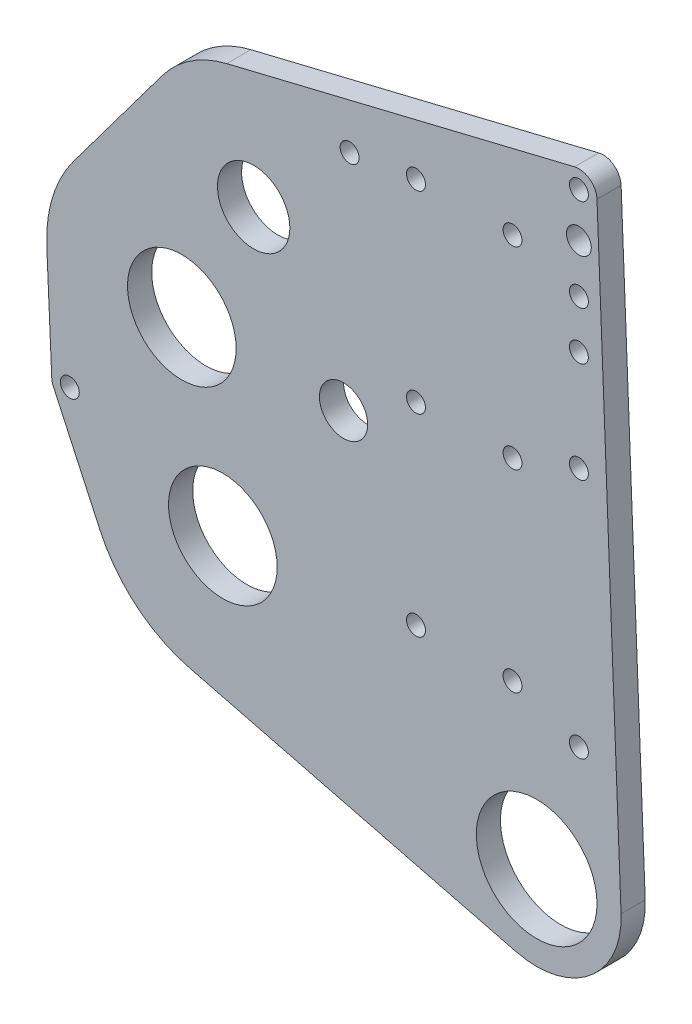
ISO-10303-21;
HEADER;
FILE_DESCRIPTION(('STEP AP214'),'2;1');
FILE_NAME('part.step','',(''),(''),'','','');
FILE_SCHEMA(('AUTOMOTIVE_DESIGN { 1 0 10303 214 1 1 1 1 }'));
ENDSEC;
DATA;
#1=APPLICATION_CONTEXT('core data for automotive mechanical design processes');
#2=APPLICATION_PROTOCOL_DEFINITION('international standard','automotive_design',2000,#1);
#3=PRODUCT_CONTEXT('',#1,'mechanical');
#4=PRODUCT('Part','Part','',(#3));
#5=PRODUCT_RELATED_PRODUCT_CATEGORY('part','',(#4));
#6=PRODUCT_DEFINITION_FORMATION('','',#4);
#7=PRODUCT_DEFINITION_CONTEXT('part definition',#1,'design');
#8=PRODUCT_DEFINITION('design','',#6,#7);
#9=PRODUCT_DEFINITION_SHAPE('','',#8);
#10=(LENGTH_UNIT() NAMED_UNIT(*) SI_UNIT(.MILLI.,.METRE.));
#11=(NAMED_UNIT(*) PLANE_ANGLE_UNIT() SI_UNIT($,.RADIAN.));
#12=(NAMED_UNIT(*) SI_UNIT($,.STERADIAN.) SOLID_ANGLE_UNIT());
#13=UNCERTAINTY_MEASURE_WITH_UNIT(LENGTH_MEASURE(1.E-05),#10,'distance_accuracy_value','');
#14=(GEOMETRIC_REPRESENTATION_CONTEXT(3) GLOBAL_UNCERTAINTY_ASSIGNED_CONTEXT((#13)) GLOBAL_UNIT_ASSIGNED_CONTEXT((#10,
#11,#12)) REPRESENTATION_CONTEXT('',''));
#15=CARTESIAN_POINT('',(0.,0.,0.));
#16=DIRECTION('',(0.,0.,1.));
#17=DIRECTION('',(1.,0.,0.));
#18=AXIS2_PLACEMENT_3D('',#15,#16,#17);
#19=CARTESIAN_POINT('',(-81.4649837073853,-3.60509332241219,6.35));
#20=DIRECTION('',(0.999022259122611,0.0442100189725756,0.));
#21=DIRECTION('',(-0.0442100189725756,0.999022259122611,0.));
#22=AXIS2_PLACEMENT_3D('',#19,#20,#21);
#23=PLANE('',#22);
#24=DIRECTION('',(0.0442100189725756,-0.999022259122611,0.));
#25=VECTOR('',#24,1.);
#26=CARTESIAN_POINT('',(-81.4649837073853,-3.60509332241219,0.));
#27=LINE('',#26,#25);
#28=CARTESIAN_POINT('',(-84.4202315344,63.1752073656032,0.));
#29=VERTEX_POINT('',#28);
#30=CARTESIAN_POINT('',(-83.1225405635379,33.8510361600236,0.));
#31=VERTEX_POINT('',#30);
#32=EDGE_CURVE('E248',#29,#31,#27,.T.);
#33=ORIENTED_EDGE('',*,*,#32,.T.);
#34=DIRECTION('',(0.,0.,-1.));
#35=VECTOR('',#34,1.);
#36=CARTESIAN_POINT('',(-83.1225405635379,33.8510361600236,6.35));
#37=LINE('',#36,#35);
#38=CARTESIAN_POINT('',(-83.1225405635379,33.8510361600236,6.35));
#39=VERTEX_POINT('',#38);
#40=EDGE_CURVE('E11',#39,#31,#37,.T.);
#41=ORIENTED_EDGE('',*,*,#40,.F.);
#42=DIRECTION('',(0.0442100189725756,-0.999022259122611,0.));
#43=VECTOR('',#42,1.);
#44=CARTESIAN_POINT('',(-81.4649837073853,-3.60509332241219,6.35));
#45=LINE('',#44,#43);
#46=CARTESIAN_POINT('',(-84.4202315344,63.1752073656032,6.35));
#47=VERTEX_POINT('',#46);
#48=EDGE_CURVE('E362',#47,#39,#45,.T.);
#49=ORIENTED_EDGE('',*,*,#48,.F.);
#50=DIRECTION('',(0.,0.,-1.));
#51=VECTOR('',#50,1.);
#52=CARTESIAN_POINT('',(-84.4202315344,63.1752073656032,6.35));
#53=LINE('',#52,#51);
#54=EDGE_CURVE('E168',#47,#29,#53,.T.);
#55=ORIENTED_EDGE('',*,*,#54,.T.);
#56=EDGE_LOOP('',(#33,#41,#49,#55));
#57=FACE_BOUND('',#56,.T.);
#58=ADVANCED_FACE('F47',(#57),#23,.F.);
#59=CARTESIAN_POINT('',(-78.3646970544664,34.0615863753805,6.35));
#60=DIRECTION('',(0.,0.,-1.));
#61=DIRECTION('',(-1.,0.,0.));
#62=AXIS2_PLACEMENT_3D('',#59,#60,#61);
#63=CYLINDRICAL_SURFACE('',#62,4.76250000000001);
#64=CARTESIAN_POINT('',(-78.3646970544664,34.0615863753805,0.));
#65=DIRECTION('',(0.,0.,1.));
#66=DIRECTION('',(1.,0.,0.));
#67=AXIS2_PLACEMENT_3D('',#64,#65,#66);
#68=CIRCLE('',#67,4.76250000000001);
#69=CARTESIAN_POINT('',(-82.6886710093196,32.0654261894858,0.));
#70=VERTEX_POINT('',#69);
#71=EDGE_CURVE('E252',#31,#70,#68,.T.);
#72=ORIENTED_EDGE('',*,*,#71,.T.);
#73=DIRECTION('',(0.,0.,-1.));
#74=VECTOR('',#73,1.);
#75=CARTESIAN_POINT('',(-82.6886710093196,32.0654261894858,6.35));
#76=LINE('',#75,#74);
#77=CARTESIAN_POINT('',(-82.6886710093196,32.0654261894858,6.35));
#78=VERTEX_POINT('',#77);
#79=EDGE_CURVE('E57',#78,#70,#76,.T.);
#80=ORIENTED_EDGE('',*,*,#79,.F.);
#81=CARTESIAN_POINT('',(-78.3646970544664,34.0615863753805,6.35));
#82=DIRECTION('',(0.,0.,1.));
#83=DIRECTION('',(1.,0.,0.));
#84=AXIS2_PLACEMENT_3D('',#81,#82,#83);
#85=CIRCLE('',#84,4.76250000000001);
#86=EDGE_CURVE('E120',#39,#78,#85,.T.);
#87=ORIENTED_EDGE('',*,*,#86,.F.);
#88=ORIENTED_EDGE('',*,*,#40,.T.);
#89=EDGE_LOOP('',(#72,#80,#87,#88));
#90=FACE_BOUND('',#89,.T.);
#91=ADVANCED_FACE('F377',(#90),#63,.T.);
#92=CARTESIAN_POINT('',(-55.9595694301041,-25.8337042920453,6.35));
#93=DIRECTION('',(0.907921040389125,0.419141246382087,0.));
#94=DIRECTION('',(-0.419141246382087,0.907921040389125,0.));
#95=AXIS2_PLACEMENT_3D('',#92,#93,#94);
#96=PLANE('',#95);
#97=DIRECTION('',(0.419141246382087,-0.907921040389125,0.));
#98=VECTOR('',#97,1.);
#99=CARTESIAN_POINT('',(-55.9595694301041,-25.8337042920453,0.));
#100=LINE('',#99,#98);
#101=CARTESIAN_POINT('',(-70.3856721962373,5.41533727865297,0.));
#102=VERTEX_POINT('',#101);
#103=EDGE_CURVE('E255',#70,#102,#100,.T.);
#104=ORIENTED_EDGE('',*,*,#103,.T.);
#105=DIRECTION('',(0.,0.,-1.));
#106=VECTOR('',#105,1.);
#107=CARTESIAN_POINT('',(-70.3856721962373,5.41533727865297,6.35));
#108=LINE('',#107,#106);
#109=CARTESIAN_POINT('',(-70.3856721962373,5.41533727865297,6.35));
#110=VERTEX_POINT('',#109);
#111=EDGE_CURVE('E310',#110,#102,#108,.T.);
#112=ORIENTED_EDGE('',*,*,#111,.F.);
#113=DIRECTION('',(0.419141246382087,-0.907921040389125,0.));
#114=VECTOR('',#113,1.);
#115=CARTESIAN_POINT('',(-55.9595694301041,-25.8337042920453,6.35));
#116=LINE('',#115,#114);
#117=EDGE_CURVE('E320',#78,#110,#116,.T.);
#118=ORIENTED_EDGE('',*,*,#117,.F.);
#119=ORIENTED_EDGE('',*,*,#79,.T.);
#120=EDGE_LOOP('',(#104,#112,#118,#119));
#121=FACE_BOUND('',#120,.T.);
#122=ADVANCED_FACE('F318',(#121),#96,.F.);
#123=CARTESIAN_POINT('',(-38.1,20.32,6.35));
#124=DIRECTION('',(0.,0.,-1.));
#125=DIRECTION('',(-1.,0.,0.));
#126=AXIS2_PLACEMENT_3D('',#123,#124,#125);
#127=CYLINDRICAL_SURFACE('',#126,35.56);
#128=CARTESIAN_POINT('',(-38.1,20.32,0.));
#129=DIRECTION('',(0.,0.,1.));
#130=DIRECTION('',(1.,0.,0.));
#131=AXIS2_PLACEMENT_3D('',#128,#129,#130);
#132=CIRCLE('',#131,35.56);
#133=CARTESIAN_POINT('',(-46.8094811901803,-14.1569276096043,0.));
#134=VERTEX_POINT('',#133);
#135=EDGE_CURVE('E258',#102,#134,#132,.T.);
#136=ORIENTED_EDGE('',*,*,#135,.T.);
#137=DIRECTION('',(0.,0.,-1.));
#138=VECTOR('',#137,1.);
#139=CARTESIAN_POINT('',(-46.8094811901803,-14.1569276096043,6.35));
#140=LINE('',#139,#138);
#141=CARTESIAN_POINT('',(-46.8094811901803,-14.1569276096043,6.35));
#142=VERTEX_POINT('',#141);
#143=EDGE_CURVE('E306',#142,#134,#140,.T.);
#144=ORIENTED_EDGE('',*,*,#143,.F.);
#145=CARTESIAN_POINT('',(-38.1,20.32,6.35));
#146=DIRECTION('',(0.,0.,1.));
#147=DIRECTION('',(1.,0.,0.));
#148=AXIS2_PLACEMENT_3D('',#145,#146,#147);
#149=CIRCLE('',#148,35.56);
#150=EDGE_CURVE('E339',#110,#142,#149,.T.);
#151=ORIENTED_EDGE('',*,*,#150,.F.);
#152=ORIENTED_EDGE('',*,*,#111,.T.);
#153=EDGE_LOOP('',(#136,#144,#151,#152));
#154=FACE_BOUND('',#153,.T.);
#155=ADVANCED_FACE('F329',(#154),#127,.T.);
#156=CARTESIAN_POINT('',(-6.1697429589074,-24.423243671959,6.35));
#157=DIRECTION('',(0.244923543030941,0.969542396220594,0.));
#158=DIRECTION('',(-0.969542396220594,0.244923543030941,0.));
#159=AXIS2_PLACEMENT_3D('',#156,#157,#158);
#160=PLANE('',#159);
#161=DIRECTION('',(0.969542396220594,-0.244923543030941,0.));
#162=VECTOR('',#161,1.);
#163=CARTESIAN_POINT('',(-6.1697429589074,-24.423243671959,0.));
#164=LINE('',#163,#162);
#165=CARTESIAN_POINT('',(39.0065742561373,-35.8355797560027,0.));
#166=VERTEX_POINT('',#165);
#167=EDGE_CURVE('E261',#134,#166,#164,.T.);
#168=ORIENTED_EDGE('',*,*,#167,.T.);
#169=DIRECTION('',(0.,0.,-1.));
#170=VECTOR('',#169,1.);
#171=CARTESIAN_POINT('',(39.0065742561373,-35.8355797560027,6.35));
#172=LINE('',#171,#170);
#173=CARTESIAN_POINT('',(39.0065742561373,-35.8355797560027,6.35));
#174=VERTEX_POINT('',#173);
#175=EDGE_CURVE('E302',#174,#166,#172,.T.);
#176=ORIENTED_EDGE('',*,*,#175,.F.);
#177=DIRECTION('',(0.969542396220594,-0.244923543030941,0.));
#178=VECTOR('',#177,1.);
#179=CARTESIAN_POINT('',(-6.1697429589074,-24.423243671959,6.35));
#180=LINE('',#179,#178);
#181=EDGE_CURVE('E335',#142,#174,#180,.T.);
#182=ORIENTED_EDGE('',*,*,#181,.F.);
#183=ORIENTED_EDGE('',*,*,#143,.T.);
#184=EDGE_LOOP('',(#168,#176,#182,#183));
#185=FACE_BOUND('',#184,.T.);
#186=ADVANCED_FACE('F333',(#185),#160,.F.);
#187=CARTESIAN_POINT('',(44.45,-14.2875,6.35));
#188=DIRECTION('',(0.,0.,-1.));
#189=DIRECTION('',(-1.,0.,0.));
#190=AXIS2_PLACEMENT_3D('',#187,#188,#189);
#191=CYLINDRICAL_SURFACE('',#190,22.225);
#192=CARTESIAN_POINT('',(44.45,-14.2875,0.));
#193=DIRECTION('',(0.,0.,1.));
#194=DIRECTION('',(1.,0.,0.));
#195=AXIS2_PLACEMENT_3D('',#192,#193,#194);
#196=CIRCLE('',#195,22.225);
#197=CARTESIAN_POINT('',(66.6575154334442,-13.4060901785567,0.));
#198=VERTEX_POINT('',#197);
#199=EDGE_CURVE('E264',#166,#198,#196,.T.);
#200=ORIENTED_EDGE('',*,*,#199,.T.);
#201=DIRECTION('',(0.,0.,-1.));
#202=VECTOR('',#201,1.);
#203=CARTESIAN_POINT('',(66.6575154334442,-13.4060901785567,6.35));
#204=LINE('',#203,#202);
#205=CARTESIAN_POINT('',(66.6575154334442,-13.4060901785567,6.35));
#206=VERTEX_POINT('',#205);
#207=EDGE_CURVE('E299',#206,#198,#204,.T.);
#208=ORIENTED_EDGE('',*,*,#207,.F.);
#209=CARTESIAN_POINT('',(44.45,-14.2875,6.35));
#210=DIRECTION('',(0.,0.,1.));
#211=DIRECTION('',(1.,0.,0.));
#212=AXIS2_PLACEMENT_3D('',#209,#210,#211);
#213=CIRCLE('',#212,22.225);
#214=EDGE_CURVE('E338',#174,#206,#213,.T.);
#215=ORIENTED_EDGE('',*,*,#214,.F.);
#216=ORIENTED_EDGE('',*,*,#175,.T.);
#217=EDGE_LOOP('',(#200,#208,#215,#216));
#218=FACE_BOUND('',#217,.T.);
#219=ADVANCED_FACE('F684',(#218),#191,.T.);
#220=CARTESIAN_POINT('',(66.0214298426699,2.62037132715079,6.35));
#221=DIRECTION('',(0.999213292843385,0.0396584846543646,0.));
#222=DIRECTION('',(-0.0396584846543647,0.999213292843385,0.));
#223=AXIS2_PLACEMENT_3D('',#220,#221,#222);
#224=PLANE('',#223);
#225=DIRECTION('',(0.0396584846543647,-0.999213292843385,0.));
#226=VECTOR('',#225,1.);
#227=CARTESIAN_POINT('',(66.0214298426699,2.62037132715079,0.));
#228=LINE('',#227,#226);
#229=CARTESIAN_POINT('',(60.3212533071744,146.238873533191,0.));
#230=VERTEX_POINT('',#229);
#231=EDGE_CURVE('E268',#230,#198,#228,.T.);
#232=ORIENTED_EDGE('',*,*,#231,.F.);
#233=DIRECTION('',(0.,0.,-1.));
#234=VECTOR('',#233,1.);
#235=CARTESIAN_POINT('',(60.3212533071744,146.238873533191,6.35));
#236=LINE('',#235,#234);
#237=CARTESIAN_POINT('',(60.3212533071744,146.238873533191,6.35));
#238=VERTEX_POINT('',#237);
#239=EDGE_CURVE('E296',#238,#230,#236,.T.);
#240=ORIENTED_EDGE('',*,*,#239,.F.);
#241=DIRECTION('',(0.0396584846543647,-0.999213292843385,0.));
#242=VECTOR('',#241,1.);
#243=CARTESIAN_POINT('',(66.0214298426699,2.62037132715079,6.35));
#244=LINE('',#243,#242);
#245=EDGE_CURVE('E343',#238,#206,#244,.T.);
#246=ORIENTED_EDGE('',*,*,#245,.T.);
#247=ORIENTED_EDGE('',*,*,#207,.T.);
#248=EDGE_LOOP('',(#232,#240,#246,#247));
#249=FACE_BOUND('',#248,.T.);
#250=ADVANCED_FACE('F674',(#249),#224,.T.);
#251=CARTESIAN_POINT('',(55.5625000000077,146.050000000024,6.35));
#252=DIRECTION('',(0.,0.,-1.));
#253=DIRECTION('',(-1.,0.,0.));
#254=AXIS2_PLACEMENT_3D('',#251,#252,#253);
#255=CYLINDRICAL_SURFACE('',#254,4.76250000000002);
#256=CARTESIAN_POINT('',(55.5625000000077,146.050000000024,0.));
#257=DIRECTION('',(0.,0.,1.));
#258=DIRECTION('',(1.,0.,0.));
#259=AXIS2_PLACEMENT_3D('',#256,#257,#258);
#260=CIRCLE('',#259,4.76250000000002);
#261=CARTESIAN_POINT('',(54.4379586815956,150.677830277075,0.));
#262=VERTEX_POINT('',#261);
#263=EDGE_CURVE('E272',#230,#262,#260,.T.);
#264=ORIENTED_EDGE('',*,*,#263,.T.);
#265=DIRECTION('',(0.,0.,-1.));
#266=VECTOR('',#265,1.);
#267=CARTESIAN_POINT('',(54.4379586815956,150.677830277075,6.35));
#268=LINE('',#267,#266);
#269=CARTESIAN_POINT('',(54.4379586815956,150.677830277075,6.35));
#270=VERTEX_POINT('',#269);
#271=EDGE_CURVE('E293',#270,#262,#268,.T.);
#272=ORIENTED_EDGE('',*,*,#271,.F.);
#273=CARTESIAN_POINT('',(55.5625000000077,146.050000000024,6.35));
#274=DIRECTION('',(0.,0.,1.));
#275=DIRECTION('',(1.,0.,0.));
#276=AXIS2_PLACEMENT_3D('',#273,#274,#275);
#277=CIRCLE('',#276,4.76250000000002);
#278=EDGE_CURVE('E351',#238,#270,#277,.T.);
#279=ORIENTED_EDGE('',*,*,#278,.F.);
#280=ORIENTED_EDGE('',*,*,#239,.T.);
#281=EDGE_LOOP('',(#264,#272,#279,#280));
#282=FACE_BOUND('',#281,.T.);
#283=ADVANCED_FACE('F665',(#282),#255,.T.);
#284=CARTESIAN_POINT('',(-31.5374465878124,129.786205086727,6.35));
#285=DIRECTION('',(-0.23612416134638,0.971722892818971,0.));
#286=DIRECTION('',(-0.971722892818971,-0.23612416134638,0.));
#287=AXIS2_PLACEMENT_3D('',#284,#285,#286);
#288=PLANE('',#287);
#289=DIRECTION('',(0.971722892818971,0.23612416134638,0.));
#290=VECTOR('',#289,1.);
#291=CARTESIAN_POINT('',(-31.5374465878124,129.786205086727,0.));
#292=LINE('',#291,#290);
#293=CARTESIAN_POINT('',(-37.0837247711685,128.43848518189,0.));
#294=VERTEX_POINT('',#293);
#295=EDGE_CURVE('E276',#294,#262,#292,.T.);
#296=ORIENTED_EDGE('',*,*,#295,.F.);
#297=DIRECTION('',(0.,0.,-1.));
#298=VECTOR('',#297,1.);
#299=CARTESIAN_POINT('',(-37.0837247711685,128.43848518189,6.35));
#300=LINE('',#299,#298);
#301=CARTESIAN_POINT('',(-37.0837247711685,128.43848518189,6.35));
#302=VERTEX_POINT('',#301);
#303=EDGE_CURVE('E161',#302,#294,#300,.T.);
#304=ORIENTED_EDGE('',*,*,#303,.F.);
#305=DIRECTION('',(0.971722892818971,0.23612416134638,0.));
#306=VECTOR('',#305,1.);
#307=CARTESIAN_POINT('',(-31.5374465878124,129.786205086727,6.35));
#308=LINE('',#307,#306);
#309=EDGE_CURVE('E152',#302,#270,#308,.T.);
#310=ORIENTED_EDGE('',*,*,#309,.T.);
#311=ORIENTED_EDGE('',*,*,#271,.T.);
#312=EDGE_LOOP('',(#296,#304,#310,#311));
#313=FACE_BOUND('',#312,.T.);
#314=ADVANCED_FACE('F356',(#313),#288,.T.);
#315=CARTESIAN_POINT('',(-29.999999944,99.286798451737,6.35));
#316=DIRECTION('',(0.,0.,-1.));
#317=DIRECTION('',(-1.,0.,0.));
#318=AXIS2_PLACEMENT_3D('',#315,#316,#317);
#319=CYLINDRICAL_SURFACE('',#318,29.999999944);
#320=CARTESIAN_POINT('',(-29.999999944,99.286798451737,0.));
#321=DIRECTION('',(0.,0.,1.));
#322=DIRECTION('',(1.,0.,0.));
#323=AXIS2_PLACEMENT_3D('',#320,#321,#322);
#324=CIRCLE('',#323,29.999999944);
#325=CARTESIAN_POINT('',(-54.0220083124324,117.257416431845,0.));
#326=VERTEX_POINT('',#325);
#327=EDGE_CURVE('E159',#294,#326,#324,.T.);
#328=ORIENTED_EDGE('',*,*,#327,.T.);
#329=DIRECTION('',(0.,0.,-1.));
#330=VECTOR('',#329,1.);
#331=CARTESIAN_POINT('',(-54.0220083124324,117.257416431845,6.35));
#332=LINE('',#331,#330);
#333=CARTESIAN_POINT('',(-54.0220083124324,117.257416431845,6.35));
#334=VERTEX_POINT('',#333);
#335=EDGE_CURVE('E156',#334,#326,#332,.T.);
#336=ORIENTED_EDGE('',*,*,#335,.F.);
#337=CARTESIAN_POINT('',(-29.999999944,99.286798451737,6.35));
#338=DIRECTION('',(0.,0.,1.));
#339=DIRECTION('',(1.,0.,0.));
#340=AXIS2_PLACEMENT_3D('',#337,#338,#339);
#341=CIRCLE('',#340,29.999999944);
#342=EDGE_CURVE('E146',#302,#334,#341,.T.);
#343=ORIENTED_EDGE('',*,*,#342,.F.);
#344=ORIENTED_EDGE('',*,*,#303,.T.);
#345=EDGE_LOOP('',(#328,#336,#343,#344));
#346=FACE_BOUND('',#345,.T.);
#347=ADVANCED_FACE('F157',(#346),#319,.T.);
#348=CARTESIAN_POINT('',(-90.8807396002924,67.9869488036928,6.35));
#349=DIRECTION('',(0.800733613775781,-0.599020600455091,0.));
#350=DIRECTION('',(0.599020600455091,0.800733613775781,0.));
#351=AXIS2_PLACEMENT_3D('',#348,#349,#350);
#352=PLANE('',#351);
#353=DIRECTION('',(-0.599020600455091,-0.800733613775781,0.));
#354=VECTOR('',#353,1.);
#355=CARTESIAN_POINT('',(-90.8807396002924,67.9869488036928,0.));
#356=LINE('',#355,#354);
#357=CARTESIAN_POINT('',(-77.3690873058668,86.048488192451,0.));
#358=VERTEX_POINT('',#357);
#359=EDGE_CURVE('E106',#326,#358,#356,.T.);
#360=ORIENTED_EDGE('',*,*,#359,.T.);
#361=DIRECTION('',(0.,0.,-1.));
#362=VECTOR('',#361,1.);
#363=CARTESIAN_POINT('',(-77.3690873058668,86.048488192451,6.35));
#364=LINE('',#363,#362);
#365=CARTESIAN_POINT('',(-77.3690873058668,86.048488192451,6.35));
#366=VERTEX_POINT('',#365);
#367=EDGE_CURVE('E162',#366,#358,#364,.T.);
#368=ORIENTED_EDGE('',*,*,#367,.F.);
#369=DIRECTION('',(-0.599020600455091,-0.800733613775781,0.));
#370=VECTOR('',#369,1.);
#371=CARTESIAN_POINT('',(-90.8807396002924,67.9869488036928,6.35));
#372=LINE('',#371,#370);
#373=EDGE_CURVE('E150',#334,#366,#372,.T.);
#374=ORIENTED_EDGE('',*,*,#373,.F.);
#375=ORIENTED_EDGE('',*,*,#335,.T.);
#376=EDGE_LOOP('',(#360,#368,#374,#375));
#377=FACE_BOUND('',#376,.T.);
#378=ADVANCED_FACE('F164',(#377),#352,.F.);
#379=CARTESIAN_POINT('',(44.45,-14.2875,6.35));
#380=DIRECTION('',(0.,0.,-1.));
#381=DIRECTION('',(-1.,0.,0.));
#382=AXIS2_PLACEMENT_3D('',#379,#380,#381);
#383=CYLINDRICAL_SURFACE('',#382,15.875);
#384=CARTESIAN_POINT('',(44.45,-14.2875,6.35));
#385=DIRECTION('',(0.,0.,1.));
#386=DIRECTION('',(1.,0.,0.));
#387=AXIS2_PLACEMENT_3D('',#384,#385,#386);
#388=CIRCLE('',#387,15.875);
#389=CARTESIAN_POINT('',(60.325,-14.2875,6.35));
#390=VERTEX_POINT('',#389);
#391=EDGE_CURVE('E806',#390,#390,#388,.T.);
#392=ORIENTED_EDGE('',*,*,#391,.T.);
#393=EDGE_LOOP('',(#392));
#394=FACE_BOUND('',#393,.T.);
#395=CARTESIAN_POINT('',(44.45,-14.2875,0.));
#396=DIRECTION('',(0.,0.,1.));
#397=DIRECTION('',(1.,0.,0.));
#398=AXIS2_PLACEMENT_3D('',#395,#396,#397);
#399=CIRCLE('',#398,15.875);
#400=CARTESIAN_POINT('',(60.325,-14.2875,0.));
#401=VERTEX_POINT('',#400);
#402=EDGE_CURVE('E244',#401,#401,#399,.T.);
#403=ORIENTED_EDGE('',*,*,#402,.F.);
#404=EDGE_LOOP('',(#403));
#405=FACE_BOUND('',#404,.T.);
#406=ADVANCED_FACE('F385',(#394,#405),#383,.F.);
#407=CARTESIAN_POINT('',(-29.999999944,99.286798451737,6.35));
#408=DIRECTION('',(0.,0.,-1.));
#409=DIRECTION('',(-1.,0.,0.));
#410=AXIS2_PLACEMENT_3D('',#407,#408,#409);
#411=CYLINDRICAL_SURFACE('',#410,9.52500000000001);
#412=CARTESIAN_POINT('',(-29.999999944,99.286798451737,6.35));
#413=DIRECTION('',(0.,0.,1.));
#414=DIRECTION('',(1.,0.,0.));
#415=AXIS2_PLACEMENT_3D('',#412,#413,#414);
#416=CIRCLE('',#415,9.52500000000001);
#417=CARTESIAN_POINT('',(-20.474999944,99.286798451737,6.35));
#418=VERTEX_POINT('',#417);
#419=EDGE_CURVE('E802',#418,#418,#416,.T.);
#420=ORIENTED_EDGE('',*,*,#419,.T.);
#421=EDGE_LOOP('',(#420));
#422=FACE_BOUND('',#421,.T.);
#423=CARTESIAN_POINT('',(-29.999999944,99.286798451737,0.));
#424=DIRECTION('',(0.,0.,1.));
#425=DIRECTION('',(1.,0.,0.));
#426=AXIS2_PLACEMENT_3D('',#423,#424,#425);
#427=CIRCLE('',#426,9.52500000000001);
#428=CARTESIAN_POINT('',(-20.474999944,99.286798451737,0.));
#429=VERTEX_POINT('',#428);
#430=EDGE_CURVE('E240',#429,#429,#427,.T.);
#431=ORIENTED_EDGE('',*,*,#430,.F.);
#432=EDGE_LOOP('',(#431));
#433=FACE_BOUND('',#432,.T.);
#434=ADVANCED_FACE('F388',(#422,#433),#411,.F.);
#435=CARTESIAN_POINT('',(12.7,127.,6.35));
#436=DIRECTION('',(0.,0.,-1.));
#437=DIRECTION('',(-1.,0.,0.));
#438=AXIS2_PLACEMENT_3D('',#435,#436,#437);
#439=CYLINDRICAL_SURFACE('',#438,2.48920000000001);
#440=CARTESIAN_POINT('',(12.7,127.,6.35));
#441=DIRECTION('',(0.,0.,1.));
#442=DIRECTION('',(1.,0.,0.));
#443=AXIS2_PLACEMENT_3D('',#440,#441,#442);
#444=CIRCLE('',#443,2.48920000000001);
#445=CARTESIAN_POINT('',(15.1892,127.,6.35));
#446=VERTEX_POINT('',#445);
#447=EDGE_CURVE('E798',#446,#446,#444,.T.);
#448=ORIENTED_EDGE('',*,*,#447,.T.);
#449=EDGE_LOOP('',(#448));
#450=FACE_BOUND('',#449,.T.);
#451=CARTESIAN_POINT('',(12.7,127.,0.));
#452=DIRECTION('',(0.,0.,1.));
#453=DIRECTION('',(1.,0.,0.));
#454=AXIS2_PLACEMENT_3D('',#451,#452,#453);
#455=CIRCLE('',#454,2.48920000000001);
#456=CARTESIAN_POINT('',(15.1892,127.,0.));
#457=VERTEX_POINT('',#456);
#458=EDGE_CURVE('E236',#457,#457,#455,.T.);
#459=ORIENTED_EDGE('',*,*,#458,.F.);
#460=EDGE_LOOP('',(#459));
#461=FACE_BOUND('',#460,.T.);
#462=ADVANCED_FACE('F392',(#450,#461),#439,.F.);
#463=CARTESIAN_POINT('',(38.1,127.,6.35));
#464=DIRECTION('',(0.,0.,-1.));
#465=DIRECTION('',(-1.,0.,0.));
#466=AXIS2_PLACEMENT_3D('',#463,#464,#465);
#467=CYLINDRICAL_SURFACE('',#466,2.48919999999997);
#468=CARTESIAN_POINT('',(38.1,127.,6.35));
#469=DIRECTION('',(0.,0.,1.));
#470=DIRECTION('',(1.,0.,0.));
#471=AXIS2_PLACEMENT_3D('',#468,#469,#470);
#472=CIRCLE('',#471,2.48919999999997);
#473=CARTESIAN_POINT('',(40.5892,127.,6.35));
#474=VERTEX_POINT('',#473);
#475=EDGE_CURVE('E794',#474,#474,#472,.T.);
#476=ORIENTED_EDGE('',*,*,#475,.T.);
#477=EDGE_LOOP('',(#476));
#478=FACE_BOUND('',#477,.T.);
#479=CARTESIAN_POINT('',(38.1,127.,0.));
#480=DIRECTION('',(0.,0.,1.));
#481=DIRECTION('',(1.,0.,0.));
#482=AXIS2_PLACEMENT_3D('',#479,#480,#481);
#483=CIRCLE('',#482,2.48919999999997);
#484=CARTESIAN_POINT('',(40.5892,127.,0.));
#485=VERTEX_POINT('',#484);
#486=EDGE_CURVE('E232',#485,#485,#483,.T.);
#487=ORIENTED_EDGE('',*,*,#486,.F.);
#488=EDGE_LOOP('',(#487));
#489=FACE_BOUND('',#488,.T.);
#490=ADVANCED_FACE('F396',(#478,#489),#467,.F.);
#491=CARTESIAN_POINT('',(38.1,76.2,6.35));
#492=DIRECTION('',(0.,0.,-1.));
#493=DIRECTION('',(-1.,0.,0.));
#494=AXIS2_PLACEMENT_3D('',#491,#492,#493);
#495=CYLINDRICAL_SURFACE('',#494,2.48919999999999);
#496=CARTESIAN_POINT('',(38.1,76.2,6.35));
#497=DIRECTION('',(0.,0.,1.));
#498=DIRECTION('',(1.,0.,0.));
#499=AXIS2_PLACEMENT_3D('',#496,#497,#498);
#500=CIRCLE('',#499,2.48919999999999);
#501=CARTESIAN_POINT('',(40.5892,76.2,6.35));
#502=VERTEX_POINT('',#501);
#503=EDGE_CURVE('E790',#502,#502,#500,.T.);
#504=ORIENTED_EDGE('',*,*,#503,.T.);
#505=EDGE_LOOP('',(#504));
#506=FACE_BOUND('',#505,.T.);
#507=CARTESIAN_POINT('',(38.1,76.2,0.));
#508=DIRECTION('',(0.,0.,1.));
#509=DIRECTION('',(1.,0.,0.));
#510=AXIS2_PLACEMENT_3D('',#507,#508,#509);
#511=CIRCLE('',#510,2.48919999999999);
#512=CARTESIAN_POINT('',(40.5892,76.2,0.));
#513=VERTEX_POINT('',#512);
#514=EDGE_CURVE('E228',#513,#513,#511,.T.);
#515=ORIENTED_EDGE('',*,*,#514,.F.);
#516=EDGE_LOOP('',(#515));
#517=FACE_BOUND('',#516,.T.);
#518=ADVANCED_FACE('F400',(#506,#517),#495,.F.);
#519=CARTESIAN_POINT('',(38.1,25.4,6.35));
#520=DIRECTION('',(0.,0.,-1.));
#521=DIRECTION('',(-1.,0.,0.));
#522=AXIS2_PLACEMENT_3D('',#519,#520,#521);
#523=CYLINDRICAL_SURFACE('',#522,2.4892);
#524=CARTESIAN_POINT('',(38.1,25.4,6.35));
#525=DIRECTION('',(0.,0.,1.));
#526=DIRECTION('',(1.,0.,0.));
#527=AXIS2_PLACEMENT_3D('',#524,#525,#526);
#528=CIRCLE('',#527,2.4892);
#529=CARTESIAN_POINT('',(40.5892,25.4,6.35));
#530=VERTEX_POINT('',#529);
#531=EDGE_CURVE('E786',#530,#530,#528,.T.);
#532=ORIENTED_EDGE('',*,*,#531,.T.);
#533=EDGE_LOOP('',(#532));
#534=FACE_BOUND('',#533,.T.);
#535=CARTESIAN_POINT('',(38.1,25.4,0.));
#536=DIRECTION('',(0.,0.,1.));
#537=DIRECTION('',(1.,0.,0.));
#538=AXIS2_PLACEMENT_3D('',#535,#536,#537);
#539=CIRCLE('',#538,2.4892);
#540=CARTESIAN_POINT('',(40.5892,25.4,0.));
#541=VERTEX_POINT('',#540);
#542=EDGE_CURVE('E224',#541,#541,#539,.T.);
#543=ORIENTED_EDGE('',*,*,#542,.F.);
#544=EDGE_LOOP('',(#543));
#545=FACE_BOUND('',#544,.T.);
#546=ADVANCED_FACE('F404',(#534,#545),#523,.F.);
#547=CARTESIAN_POINT('',(12.7,25.4,6.35));
#548=DIRECTION('',(0.,0.,-1.));
#549=DIRECTION('',(-1.,0.,0.));
#550=AXIS2_PLACEMENT_3D('',#547,#548,#549);
#551=CYLINDRICAL_SURFACE('',#550,2.4892);
#552=CARTESIAN_POINT('',(12.7,25.4,6.35));
#553=DIRECTION('',(0.,0.,1.));
#554=DIRECTION('',(1.,0.,0.));
#555=AXIS2_PLACEMENT_3D('',#552,#553,#554);
#556=CIRCLE('',#555,2.4892);
#557=CARTESIAN_POINT('',(15.1892,25.4,6.35));
#558=VERTEX_POINT('',#557);
#559=EDGE_CURVE('E782',#558,#558,#556,.T.);
#560=ORIENTED_EDGE('',*,*,#559,.T.);
#561=EDGE_LOOP('',(#560));
#562=FACE_BOUND('',#561,.T.);
#563=CARTESIAN_POINT('',(12.7,25.4,0.));
#564=DIRECTION('',(0.,0.,1.));
#565=DIRECTION('',(1.,0.,0.));
#566=AXIS2_PLACEMENT_3D('',#563,#564,#565);
#567=CIRCLE('',#566,2.4892);
#568=CARTESIAN_POINT('',(15.1892,25.4,0.));
#569=VERTEX_POINT('',#568);
#570=EDGE_CURVE('E220',#569,#569,#567,.T.);
#571=ORIENTED_EDGE('',*,*,#570,.F.);
#572=EDGE_LOOP('',(#571));
#573=FACE_BOUND('',#572,.T.);
#574=ADVANCED_FACE('F408',(#562,#573),#551,.F.);
#575=CARTESIAN_POINT('',(12.7,76.2,6.35));
#576=DIRECTION('',(0.,0.,-1.));
#577=DIRECTION('',(-1.,0.,0.));
#578=AXIS2_PLACEMENT_3D('',#575,#576,#577);
#579=CYLINDRICAL_SURFACE('',#578,2.48919999999999);
#580=CARTESIAN_POINT('',(12.7,76.2,6.35));
#581=DIRECTION('',(0.,0.,1.));
#582=DIRECTION('',(1.,0.,0.));
#583=AXIS2_PLACEMENT_3D('',#580,#581,#582);
#584=CIRCLE('',#583,2.48919999999999);
#585=CARTESIAN_POINT('',(15.1892,76.2,6.35));
#586=VERTEX_POINT('',#585);
#587=EDGE_CURVE('E778',#586,#586,#584,.T.);
#588=ORIENTED_EDGE('',*,*,#587,.T.);
#589=EDGE_LOOP('',(#588));
#590=FACE_BOUND('',#589,.T.);
#591=CARTESIAN_POINT('',(12.7,76.2,0.));
#592=DIRECTION('',(0.,0.,1.));
#593=DIRECTION('',(1.,0.,0.));
#594=AXIS2_PLACEMENT_3D('',#591,#592,#593);
#595=CIRCLE('',#594,2.48919999999999);
#596=CARTESIAN_POINT('',(15.1892,76.2,0.));
#597=VERTEX_POINT('',#596);
#598=EDGE_CURVE('E216',#597,#597,#595,.T.);
#599=ORIENTED_EDGE('',*,*,#598,.F.);
#600=EDGE_LOOP('',(#599));
#601=FACE_BOUND('',#600,.T.);
#602=ADVANCED_FACE('F412',(#590,#601),#579,.F.);
#603=CARTESIAN_POINT('',(-38.1,20.32,6.35));
#604=DIRECTION('',(0.,0.,-1.));
#605=DIRECTION('',(-1.,0.,0.));
#606=AXIS2_PLACEMENT_3D('',#603,#604,#605);
#607=CYLINDRICAL_SURFACE('',#606,14.2875);
#608=CARTESIAN_POINT('',(-38.1,20.32,6.35));
#609=DIRECTION('',(0.,0.,1.));
#610=DIRECTION('',(1.,0.,0.));
#611=AXIS2_PLACEMENT_3D('',#608,#609,#610);
#612=CIRCLE('',#611,14.2875);
#613=CARTESIAN_POINT('',(-23.8125,20.32,6.35));
#614=VERTEX_POINT('',#613);
#615=EDGE_CURVE('E774',#614,#614,#612,.T.);
#616=ORIENTED_EDGE('',*,*,#615,.T.);
#617=EDGE_LOOP('',(#616));
#618=FACE_BOUND('',#617,.T.);
#619=CARTESIAN_POINT('',(-38.1,20.32,0.));
#620=DIRECTION('',(0.,0.,1.));
#621=DIRECTION('',(1.,0.,0.));
#622=AXIS2_PLACEMENT_3D('',#619,#620,#621);
#623=CIRCLE('',#622,14.2875);
#624=CARTESIAN_POINT('',(-23.8125,20.32,0.));
#625=VERTEX_POINT('',#624);
#626=EDGE_CURVE('E212',#625,#625,#623,.T.);
#627=ORIENTED_EDGE('',*,*,#626,.F.);
#628=EDGE_LOOP('',(#627));
#629=FACE_BOUND('',#628,.T.);
#630=ADVANCED_FACE('F416',(#618,#629),#607,.F.);
#631=CARTESIAN_POINT('',(-48.895,64.747315640268,6.35));
#632=DIRECTION('',(0.,0.,-1.));
#633=DIRECTION('',(-1.,0.,0.));
#634=AXIS2_PLACEMENT_3D('',#631,#632,#633);
#635=CYLINDRICAL_SURFACE('',#634,14.2875);
#636=CARTESIAN_POINT('',(-48.895,64.747315640268,6.35));
#637=DIRECTION('',(0.,0.,1.));
#638=DIRECTION('',(1.,0.,0.));
#639=AXIS2_PLACEMENT_3D('',#636,#637,#638);
#640=CIRCLE('',#639,14.2875);
#641=CARTESIAN_POINT('',(-34.6075,64.747315640268,6.35));
#642=VERTEX_POINT('',#641);
#643=EDGE_CURVE('E770',#642,#642,#640,.T.);
#644=ORIENTED_EDGE('',*,*,#643,.T.);
#645=EDGE_LOOP('',(#644));
#646=FACE_BOUND('',#645,.T.);
#647=CARTESIAN_POINT('',(-48.895,64.747315640268,0.));
#648=DIRECTION('',(0.,0.,1.));
#649=DIRECTION('',(1.,0.,0.));
#650=AXIS2_PLACEMENT_3D('',#647,#648,#649);
#651=CIRCLE('',#650,14.2875);
#652=CARTESIAN_POINT('',(-34.6075,64.747315640268,0.));
#653=VERTEX_POINT('',#652);
#654=EDGE_CURVE('E208',#653,#653,#651,.T.);
#655=ORIENTED_EDGE('',*,*,#654,.F.);
#656=EDGE_LOOP('',(#655));
#657=FACE_BOUND('',#656,.T.);
#658=ADVANCED_FACE('F420',(#646,#657),#635,.F.);
#659=CARTESIAN_POINT('',(-4.7625,124.338389151263,6.35));
#660=DIRECTION('',(0.,0.,-1.));
#661=DIRECTION('',(-1.,0.,0.));
#662=AXIS2_PLACEMENT_3D('',#659,#660,#661);
#663=CYLINDRICAL_SURFACE('',#662,2.48920000000001);
#664=CARTESIAN_POINT('',(-4.7625,124.338389151263,6.35));
#665=DIRECTION('',(0.,0.,1.));
#666=DIRECTION('',(1.,0.,0.));
#667=AXIS2_PLACEMENT_3D('',#664,#665,#666);
#668=CIRCLE('',#667,2.48920000000001);
#669=CARTESIAN_POINT('',(-2.27329999999999,124.338389151263,6.35));
#670=VERTEX_POINT('',#669);
#671=EDGE_CURVE('E766',#670,#670,#668,.T.);
#672=ORIENTED_EDGE('',*,*,#671,.T.);
#673=EDGE_LOOP('',(#672));
#674=FACE_BOUND('',#673,.T.);
#675=CARTESIAN_POINT('',(-4.7625,124.338389151263,0.));
#676=DIRECTION('',(0.,0.,1.));
#677=DIRECTION('',(1.,0.,0.));
#678=AXIS2_PLACEMENT_3D('',#675,#676,#677);
#679=CIRCLE('',#678,2.48920000000001);
#680=CARTESIAN_POINT('',(-2.27329999999999,124.338389151263,0.));
#681=VERTEX_POINT('',#680);
#682=EDGE_CURVE('E204',#681,#681,#679,.T.);
#683=ORIENTED_EDGE('',*,*,#682,.F.);
#684=EDGE_LOOP('',(#683));
#685=FACE_BOUND('',#684,.T.);
#686=ADVANCED_FACE('F424',(#674,#685),#663,.F.);
#687=CARTESIAN_POINT('',(55.5625000000077,146.050000000024,6.35));
#688=DIRECTION('',(0.,0.,-1.));
#689=DIRECTION('',(-1.,0.,0.));
#690=AXIS2_PLACEMENT_3D('',#687,#688,#689);
#691=CYLINDRICAL_SURFACE('',#690,2.4892);
#692=CARTESIAN_POINT('',(55.5625000000077,146.050000000024,6.35));
#693=DIRECTION('',(0.,0.,1.));
#694=DIRECTION('',(1.,0.,0.));
#695=AXIS2_PLACEMENT_3D('',#692,#693,#694);
#696=CIRCLE('',#695,2.4892);
#697=CARTESIAN_POINT('',(58.0517000000077,146.050000000024,6.35));
#698=VERTEX_POINT('',#697);
#699=EDGE_CURVE('E762',#698,#698,#696,.T.);
#700=ORIENTED_EDGE('',*,*,#699,.T.);
#701=EDGE_LOOP('',(#700));
#702=FACE_BOUND('',#701,.T.);
#703=CARTESIAN_POINT('',(55.5625000000077,146.050000000024,0.));
#704=DIRECTION('',(0.,0.,1.));
#705=DIRECTION('',(1.,0.,0.));
#706=AXIS2_PLACEMENT_3D('',#703,#704,#705);
#707=CIRCLE('',#706,2.4892);
#708=CARTESIAN_POINT('',(58.0517000000077,146.050000000024,0.));
#709=VERTEX_POINT('',#708);
#710=EDGE_CURVE('E200',#709,#709,#707,.T.);
#711=ORIENTED_EDGE('',*,*,#710,.F.);
#712=EDGE_LOOP('',(#711));
#713=FACE_BOUND('',#712,.T.);
#714=ADVANCED_FACE('F428',(#702,#713),#691,.F.);
#715=CARTESIAN_POINT('',(55.5625000000077,82.5500000000245,6.35));
#716=DIRECTION('',(0.,0.,-1.));
#717=DIRECTION('',(-1.,0.,0.));
#718=AXIS2_PLACEMENT_3D('',#715,#716,#717);
#719=CYLINDRICAL_SURFACE('',#718,2.4892);
#720=CARTESIAN_POINT('',(55.5625000000077,82.5500000000245,6.35));
#721=DIRECTION('',(0.,0.,1.));
#722=DIRECTION('',(1.,0.,0.));
#723=AXIS2_PLACEMENT_3D('',#720,#721,#722);
#724=CIRCLE('',#723,2.4892);
#725=CARTESIAN_POINT('',(58.0517000000077,82.5500000000245,6.35));
#726=VERTEX_POINT('',#725);
#727=EDGE_CURVE('E758',#726,#726,#724,.T.);
#728=ORIENTED_EDGE('',*,*,#727,.T.);
#729=EDGE_LOOP('',(#728));
#730=FACE_BOUND('',#729,.T.);
#731=CARTESIAN_POINT('',(55.5625000000077,82.5500000000245,0.));
#732=DIRECTION('',(0.,0.,1.));
#733=DIRECTION('',(1.,0.,0.));
#734=AXIS2_PLACEMENT_3D('',#731,#732,#733);
#735=CIRCLE('',#734,2.4892);
#736=CARTESIAN_POINT('',(58.0517000000077,82.5500000000245,0.));
#737=VERTEX_POINT('',#736);
#738=EDGE_CURVE('E196',#737,#737,#735,.T.);
#739=ORIENTED_EDGE('',*,*,#738,.F.);
#740=EDGE_LOOP('',(#739));
#741=FACE_BOUND('',#740,.T.);
#742=ADVANCED_FACE('F432',(#730,#741),#719,.F.);
#743=CARTESIAN_POINT('',(55.5625000000077,19.0500000000245,6.35));
#744=DIRECTION('',(0.,0.,-1.));
#745=DIRECTION('',(-1.,0.,0.));
#746=AXIS2_PLACEMENT_3D('',#743,#744,#745);
#747=CYLINDRICAL_SURFACE('',#746,2.4892);
#748=CARTESIAN_POINT('',(55.5625000000077,19.0500000000245,6.35));
#749=DIRECTION('',(0.,0.,1.));
#750=DIRECTION('',(1.,0.,0.));
#751=AXIS2_PLACEMENT_3D('',#748,#749,#750);
#752=CIRCLE('',#751,2.4892);
#753=CARTESIAN_POINT('',(58.0517000000077,19.0500000000245,6.35));
#754=VERTEX_POINT('',#753);
#755=EDGE_CURVE('E754',#754,#754,#752,.T.);
#756=ORIENTED_EDGE('',*,*,#755,.T.);
#757=EDGE_LOOP('',(#756));
#758=FACE_BOUND('',#757,.T.);
#759=CARTESIAN_POINT('',(55.5625000000077,19.0500000000245,0.));
#760=DIRECTION('',(0.,0.,1.));
#761=DIRECTION('',(1.,0.,0.));
#762=AXIS2_PLACEMENT_3D('',#759,#760,#761);
#763=CIRCLE('',#762,2.4892);
#764=CARTESIAN_POINT('',(58.0517000000077,19.0500000000245,0.));
#765=VERTEX_POINT('',#764);
#766=EDGE_CURVE('E192',#765,#765,#763,.T.);
#767=ORIENTED_EDGE('',*,*,#766,.F.);
#768=EDGE_LOOP('',(#767));
#769=FACE_BOUND('',#768,.T.);
#770=ADVANCED_FACE('F436',(#758,#769),#747,.F.);
#771=CARTESIAN_POINT('',(-6.35,64.747315640268,6.35));
#772=DIRECTION('',(0.,0.,-1.));
#773=DIRECTION('',(-1.,0.,0.));
#774=AXIS2_PLACEMENT_3D('',#771,#772,#773);
#775=CYLINDRICAL_SURFACE('',#774,6.35);
#776=CARTESIAN_POINT('',(-6.35,64.747315640268,6.35));
#777=DIRECTION('',(0.,0.,1.));
#778=DIRECTION('',(1.,0.,0.));
#779=AXIS2_PLACEMENT_3D('',#776,#777,#778);
#780=CIRCLE('',#779,6.35);
#781=CARTESIAN_POINT('',(0.,64.747315640268,6.35));
#782=VERTEX_POINT('',#781);
#783=EDGE_CURVE('E750',#782,#782,#780,.T.);
#784=ORIENTED_EDGE('',*,*,#783,.T.);
#785=EDGE_LOOP('',(#784));
#786=FACE_BOUND('',#785,.T.);
#787=CARTESIAN_POINT('',(-6.35,64.747315640268,0.));
#788=DIRECTION('',(0.,0.,1.));
#789=DIRECTION('',(1.,0.,0.));
#790=AXIS2_PLACEMENT_3D('',#787,#788,#789);
#791=CIRCLE('',#790,6.35);
#792=CARTESIAN_POINT('',(0.,64.747315640268,0.));
#793=VERTEX_POINT('',#792);
#794=EDGE_CURVE('E188',#793,#793,#791,.T.);
#795=ORIENTED_EDGE('',*,*,#794,.F.);
#796=EDGE_LOOP('',(#795));
#797=FACE_BOUND('',#796,.T.);
#798=ADVANCED_FACE('F440',(#786,#797),#775,.F.);
#799=CARTESIAN_POINT('',(-78.3646970544664,34.0615863753805,6.35));
#800=DIRECTION('',(0.,0.,-1.));
#801=DIRECTION('',(-1.,0.,0.));
#802=AXIS2_PLACEMENT_3D('',#799,#800,#801);
#803=CYLINDRICAL_SURFACE('',#802,2.48920000000002);
#804=CARTESIAN_POINT('',(-78.3646970544664,34.0615863753805,6.35));
#805=DIRECTION('',(0.,0.,1.));
#806=DIRECTION('',(1.,0.,0.));
#807=AXIS2_PLACEMENT_3D('',#804,#805,#806);
#808=CIRCLE('',#807,2.48920000000002);
#809=CARTESIAN_POINT('',(-75.8754970544664,34.0615863753805,6.35));
#810=VERTEX_POINT('',#809);
#811=EDGE_CURVE('E742',#810,#810,#808,.T.);
#812=ORIENTED_EDGE('',*,*,#811,.T.);
#813=EDGE_LOOP('',(#812));
#814=FACE_BOUND('',#813,.T.);
#815=CARTESIAN_POINT('',(-78.3646970544664,34.0615863753805,0.));
#816=DIRECTION('',(0.,0.,1.));
#817=DIRECTION('',(1.,0.,0.));
#818=AXIS2_PLACEMENT_3D('',#815,#816,#817);
#819=CIRCLE('',#818,2.48920000000002);
#820=CARTESIAN_POINT('',(-75.8754970544664,34.0615863753805,0.));
#821=VERTEX_POINT('',#820);
#822=EDGE_CURVE('E184',#821,#821,#819,.T.);
#823=ORIENTED_EDGE('',*,*,#822,.F.);
#824=EDGE_LOOP('',(#823));
#825=FACE_BOUND('',#824,.T.);
#826=ADVANCED_FACE('F444',(#814,#825),#803,.F.);
#827=CARTESIAN_POINT('',(55.5625000000077,134.440413582038,6.35));
#828=DIRECTION('',(0.,0.,-1.));
#829=DIRECTION('',(-1.,0.,0.));
#830=AXIS2_PLACEMENT_3D('',#827,#828,#829);
#831=CYLINDRICAL_SURFACE('',#830,3.2639);
#832=CARTESIAN_POINT('',(55.5625000000077,134.440413582038,6.35));
#833=DIRECTION('',(0.,0.,1.));
#834=DIRECTION('',(1.,0.,0.));
#835=AXIS2_PLACEMENT_3D('',#832,#833,#834);
#836=CIRCLE('',#835,3.2639);
#837=CARTESIAN_POINT('',(58.8264000000077,134.440413582038,6.35));
#838=VERTEX_POINT('',#837);
#839=EDGE_CURVE('E737',#838,#838,#836,.T.);
#840=ORIENTED_EDGE('',*,*,#839,.T.);
#841=EDGE_LOOP('',(#840));
#842=FACE_BOUND('',#841,.T.);
#843=CARTESIAN_POINT('',(55.5625000000077,134.440413582038,0.));
#844=DIRECTION('',(0.,0.,1.));
#845=DIRECTION('',(1.,0.,0.));
#846=AXIS2_PLACEMENT_3D('',#843,#844,#845);
#847=CIRCLE('',#846,3.2639);
#848=CARTESIAN_POINT('',(58.8264000000077,134.440413582038,0.));
#849=VERTEX_POINT('',#848);
#850=EDGE_CURVE('E180',#849,#849,#847,.T.);
#851=ORIENTED_EDGE('',*,*,#850,.F.);
#852=EDGE_LOOP('',(#851));
#853=FACE_BOUND('',#852,.T.);
#854=ADVANCED_FACE('F448',(#842,#853),#831,.F.);
#855=CARTESIAN_POINT('',(55.5625000000077,109.040413582038,6.35));
#856=DIRECTION('',(0.,0.,-1.));
#857=DIRECTION('',(-1.,0.,0.));
#858=AXIS2_PLACEMENT_3D('',#855,#856,#857);
#859=CYLINDRICAL_SURFACE('',#858,2.4892);
#860=CARTESIAN_POINT('',(55.5625000000077,109.040413582038,6.35));
#861=DIRECTION('',(0.,0.,1.));
#862=DIRECTION('',(1.,0.,0.));
#863=AXIS2_PLACEMENT_3D('',#860,#861,#862);
#864=CIRCLE('',#863,2.4892);
#865=CARTESIAN_POINT('',(58.0517000000077,109.040413582038,6.35));
#866=VERTEX_POINT('',#865);
#867=EDGE_CURVE('E459',#866,#866,#864,.T.);
#868=ORIENTED_EDGE('',*,*,#867,.T.);
#869=EDGE_LOOP('',(#868));
#870=FACE_BOUND('',#869,.T.);
#871=CARTESIAN_POINT('',(55.5625000000077,109.040413582038,0.));
#872=DIRECTION('',(0.,0.,1.));
#873=DIRECTION('',(1.,0.,0.));
#874=AXIS2_PLACEMENT_3D('',#871,#872,#873);
#875=CIRCLE('',#874,2.4892);
#876=CARTESIAN_POINT('',(58.0517000000077,109.040413582038,0.));
#877=VERTEX_POINT('',#876);
#878=EDGE_CURVE('E176',#877,#877,#875,.T.);
#879=ORIENTED_EDGE('',*,*,#878,.F.);
#880=EDGE_LOOP('',(#879));
#881=FACE_BOUND('',#880,.T.);
#882=ADVANCED_FACE('F372',(#870,#881),#859,.F.);
#883=CARTESIAN_POINT('',(55.5625000000077,121.740413582038,6.35));
#884=DIRECTION('',(0.,0.,-1.));
#885=DIRECTION('',(-1.,0.,0.));
#886=AXIS2_PLACEMENT_3D('',#883,#884,#885);
#887=CYLINDRICAL_SURFACE('',#886,2.4892);
#888=CARTESIAN_POINT('',(55.5625000000077,121.740413582038,6.35));
#889=DIRECTION('',(0.,0.,1.));
#890=DIRECTION('',(1.,0.,0.));
#891=AXIS2_PLACEMENT_3D('',#888,#889,#890);
#892=CIRCLE('',#891,2.4892);
#893=CARTESIAN_POINT('',(58.0517000000077,121.740413582038,6.35));
#894=VERTEX_POINT('',#893);
#895=EDGE_CURVE('E286',#894,#894,#892,.T.);
#896=ORIENTED_EDGE('',*,*,#895,.T.);
#897=EDGE_LOOP('',(#896));
#898=FACE_BOUND('',#897,.T.);
#899=CARTESIAN_POINT('',(55.5625000000077,121.740413582038,0.));
#900=DIRECTION('',(0.,0.,1.));
#901=DIRECTION('',(1.,0.,0.));
#902=AXIS2_PLACEMENT_3D('',#899,#900,#901);
#903=CIRCLE('',#902,2.4892);
#904=CARTESIAN_POINT('',(58.0517000000077,121.740413582038,0.));
#905=VERTEX_POINT('',#904);
#906=EDGE_CURVE('E172',#905,#905,#903,.T.);
#907=ORIENTED_EDGE('',*,*,#906,.F.);
#908=EDGE_LOOP('',(#907));
#909=FACE_BOUND('',#908,.T.);
#910=ADVANCED_FACE('F49',(#898,#909),#887,.F.);
#911=CARTESIAN_POINT('',(-48.895,64.747315640268,6.35));
#912=DIRECTION('',(0.,0.,-1.));
#913=DIRECTION('',(-1.,0.,0.));
#914=AXIS2_PLACEMENT_3D('',#911,#912,#913);
#915=CYLINDRICAL_SURFACE('',#914,35.56);
#916=CARTESIAN_POINT('',(-48.895,64.747315640268,0.));
#917=DIRECTION('',(0.,0.,1.));
#918=DIRECTION('',(1.,0.,0.));
#919=AXIS2_PLACEMENT_3D('',#916,#917,#918);
#920=CIRCLE('',#919,35.56);
#921=EDGE_CURVE('E112',#358,#29,#920,.T.);
#922=ORIENTED_EDGE('',*,*,#921,.T.);
#923=ORIENTED_EDGE('',*,*,#54,.F.);
#924=CARTESIAN_POINT('',(-48.895,64.747315640268,6.35));
#925=DIRECTION('',(0.,0.,1.));
#926=DIRECTION('',(1.,0.,0.));
#927=AXIS2_PLACEMENT_3D('',#924,#925,#926);
#928=CIRCLE('',#927,35.56);
#929=EDGE_CURVE('E65',#366,#47,#928,.T.);
#930=ORIENTED_EDGE('',*,*,#929,.F.);
#931=ORIENTED_EDGE('',*,*,#367,.T.);
#932=EDGE_LOOP('',(#922,#923,#930,#931));
#933=FACE_BOUND('',#932,.T.);
#934=ADVANCED_FACE('F363',(#933),#915,.T.);
#935=CARTESIAN_POINT('',(0.,0.,6.35));
#936=DIRECTION('',(0.,0.,1.));
#937=DIRECTION('',(1.,0.,0.));
#938=AXIS2_PLACEMENT_3D('',#935,#936,#937);
#939=PLANE('',#938);
#940=ORIENTED_EDGE('',*,*,#895,.F.);
#941=EDGE_LOOP('',(#940));
#942=FACE_BOUND('',#941,.T.);
#943=ORIENTED_EDGE('',*,*,#867,.F.);
#944=EDGE_LOOP('',(#943));
#945=FACE_BOUND('',#944,.T.);
#946=ORIENTED_EDGE('',*,*,#839,.F.);
#947=EDGE_LOOP('',(#946));
#948=FACE_BOUND('',#947,.T.);
#949=ORIENTED_EDGE('',*,*,#811,.F.);
#950=EDGE_LOOP('',(#949));
#951=FACE_BOUND('',#950,.T.);
#952=ORIENTED_EDGE('',*,*,#783,.F.);
#953=EDGE_LOOP('',(#952));
#954=FACE_BOUND('',#953,.T.);
#955=ORIENTED_EDGE('',*,*,#755,.F.);
#956=EDGE_LOOP('',(#955));
#957=FACE_BOUND('',#956,.T.);
#958=ORIENTED_EDGE('',*,*,#727,.F.);
#959=EDGE_LOOP('',(#958));
#960=FACE_BOUND('',#959,.T.);
#961=ORIENTED_EDGE('',*,*,#699,.F.);
#962=EDGE_LOOP('',(#961));
#963=FACE_BOUND('',#962,.T.);
#964=ORIENTED_EDGE('',*,*,#671,.F.);
#965=EDGE_LOOP('',(#964));
#966=FACE_BOUND('',#965,.T.);
#967=ORIENTED_EDGE('',*,*,#643,.F.);
#968=EDGE_LOOP('',(#967));
#969=FACE_BOUND('',#968,.T.);
#970=ORIENTED_EDGE('',*,*,#615,.F.);
#971=EDGE_LOOP('',(#970));
#972=FACE_BOUND('',#971,.T.);
#973=ORIENTED_EDGE('',*,*,#587,.F.);
#974=EDGE_LOOP('',(#973));
#975=FACE_BOUND('',#974,.T.);
#976=ORIENTED_EDGE('',*,*,#559,.F.);
#977=EDGE_LOOP('',(#976));
#978=FACE_BOUND('',#977,.T.);
#979=ORIENTED_EDGE('',*,*,#531,.F.);
#980=EDGE_LOOP('',(#979));
#981=FACE_BOUND('',#980,.T.);
#982=ORIENTED_EDGE('',*,*,#503,.F.);
#983=EDGE_LOOP('',(#982));
#984=FACE_BOUND('',#983,.T.);
#985=ORIENTED_EDGE('',*,*,#475,.F.);
#986=EDGE_LOOP('',(#985));
#987=FACE_BOUND('',#986,.T.);
#988=ORIENTED_EDGE('',*,*,#447,.F.);
#989=EDGE_LOOP('',(#988));
#990=FACE_BOUND('',#989,.T.);
#991=ORIENTED_EDGE('',*,*,#419,.F.);
#992=EDGE_LOOP('',(#991));
#993=FACE_BOUND('',#992,.T.);
#994=ORIENTED_EDGE('',*,*,#391,.F.);
#995=EDGE_LOOP('',(#994));
#996=FACE_BOUND('',#995,.T.);
#997=ORIENTED_EDGE('',*,*,#48,.T.);
#998=ORIENTED_EDGE('',*,*,#86,.T.);
#999=ORIENTED_EDGE('',*,*,#117,.T.);
#1000=ORIENTED_EDGE('',*,*,#150,.T.);
#1001=ORIENTED_EDGE('',*,*,#181,.T.);
#1002=ORIENTED_EDGE('',*,*,#214,.T.);
#1003=ORIENTED_EDGE('',*,*,#245,.F.);
#1004=ORIENTED_EDGE('',*,*,#278,.T.);
#1005=ORIENTED_EDGE('',*,*,#309,.F.);
#1006=ORIENTED_EDGE('',*,*,#342,.T.);
#1007=ORIENTED_EDGE('',*,*,#373,.T.);
#1008=ORIENTED_EDGE('',*,*,#929,.T.);
#1009=EDGE_LOOP('',(#997,#998,#999,#1000,#1001,#1002,#1003,#1004,#1005,#1006,#1007,#1008));
#1010=FACE_BOUND('',#1009,.T.);
#1011=ADVANCED_FACE('F148',(#942,#945,#948,#951,#954,#957,#960,#963,#966,#969,#972,#975,#978,
#981,#984,#987,#990,#993,#996,#1010),#939,.T.);
#1012=CARTESIAN_POINT('',(0.,0.,0.));
#1013=DIRECTION('',(0.,0.,1.));
#1014=DIRECTION('',(1.,0.,0.));
#1015=AXIS2_PLACEMENT_3D('',#1012,#1013,#1014);
#1016=PLANE('',#1015);
#1017=ORIENTED_EDGE('',*,*,#906,.T.);
#1018=EDGE_LOOP('',(#1017));
#1019=FACE_BOUND('',#1018,.T.);
#1020=ORIENTED_EDGE('',*,*,#878,.T.);
#1021=EDGE_LOOP('',(#1020));
#1022=FACE_BOUND('',#1021,.T.);
#1023=ORIENTED_EDGE('',*,*,#850,.T.);
#1024=EDGE_LOOP('',(#1023));
#1025=FACE_BOUND('',#1024,.T.);
#1026=ORIENTED_EDGE('',*,*,#822,.T.);
#1027=EDGE_LOOP('',(#1026));
#1028=FACE_BOUND('',#1027,.T.);
#1029=ORIENTED_EDGE('',*,*,#794,.T.);
#1030=EDGE_LOOP('',(#1029));
#1031=FACE_BOUND('',#1030,.T.);
#1032=ORIENTED_EDGE('',*,*,#766,.T.);
#1033=EDGE_LOOP('',(#1032));
#1034=FACE_BOUND('',#1033,.T.);
#1035=ORIENTED_EDGE('',*,*,#738,.T.);
#1036=EDGE_LOOP('',(#1035));
#1037=FACE_BOUND('',#1036,.T.);
#1038=ORIENTED_EDGE('',*,*,#710,.T.);
#1039=EDGE_LOOP('',(#1038));
#1040=FACE_BOUND('',#1039,.T.);
#1041=ORIENTED_EDGE('',*,*,#682,.T.);
#1042=EDGE_LOOP('',(#1041));
#1043=FACE_BOUND('',#1042,.T.);
#1044=ORIENTED_EDGE('',*,*,#654,.T.);
#1045=EDGE_LOOP('',(#1044));
#1046=FACE_BOUND('',#1045,.T.);
#1047=ORIENTED_EDGE('',*,*,#626,.T.);
#1048=EDGE_LOOP('',(#1047));
#1049=FACE_BOUND('',#1048,.T.);
#1050=ORIENTED_EDGE('',*,*,#598,.T.);
#1051=EDGE_LOOP('',(#1050));
#1052=FACE_BOUND('',#1051,.T.);
#1053=ORIENTED_EDGE('',*,*,#570,.T.);
#1054=EDGE_LOOP('',(#1053));
#1055=FACE_BOUND('',#1054,.T.);
#1056=ORIENTED_EDGE('',*,*,#542,.T.);
#1057=EDGE_LOOP('',(#1056));
#1058=FACE_BOUND('',#1057,.T.);
#1059=ORIENTED_EDGE('',*,*,#514,.T.);
#1060=EDGE_LOOP('',(#1059));
#1061=FACE_BOUND('',#1060,.T.);
#1062=ORIENTED_EDGE('',*,*,#486,.T.);
#1063=EDGE_LOOP('',(#1062));
#1064=FACE_BOUND('',#1063,.T.);
#1065=ORIENTED_EDGE('',*,*,#458,.T.);
#1066=EDGE_LOOP('',(#1065));
#1067=FACE_BOUND('',#1066,.T.);
#1068=ORIENTED_EDGE('',*,*,#430,.T.);
#1069=EDGE_LOOP('',(#1068));
#1070=FACE_BOUND('',#1069,.T.);
#1071=ORIENTED_EDGE('',*,*,#402,.T.);
#1072=EDGE_LOOP('',(#1071));
#1073=FACE_BOUND('',#1072,.T.);
#1074=ORIENTED_EDGE('',*,*,#32,.F.);
#1075=ORIENTED_EDGE('',*,*,#921,.F.);
#1076=ORIENTED_EDGE('',*,*,#359,.F.);
#1077=ORIENTED_EDGE('',*,*,#327,.F.);
#1078=ORIENTED_EDGE('',*,*,#295,.T.);
#1079=ORIENTED_EDGE('',*,*,#263,.F.);
#1080=ORIENTED_EDGE('',*,*,#231,.T.);
#1081=ORIENTED_EDGE('',*,*,#199,.F.);
#1082=ORIENTED_EDGE('',*,*,#167,.F.);
#1083=ORIENTED_EDGE('',*,*,#135,.F.);
#1084=ORIENTED_EDGE('',*,*,#103,.F.);
#1085=ORIENTED_EDGE('',*,*,#71,.F.);
#1086=EDGE_LOOP('',(#1074,#1075,#1076,#1077,#1078,#1079,#1080,#1081,#1082,#1083,#1084,#1085));
#1087=FACE_BOUND('',#1086,.T.);
#1088=ADVANCED_FACE('F324',(#1019,#1022,#1025,#1028,#1031,#1034,#1037,#1040,#1043,#1046,#1049,
#1052,#1055,#1058,#1061,#1064,#1067,#1070,#1073,#1087),#1016,.F.);
#1089=CLOSED_SHELL('',(#58,#91,#122,#155,#186,#219,#250,#283,#314,#347,#378,#406,#434,#462,#490,
#518,#546,#574,#602,#630,#658,#686,#714,#742,#770,#798,#826,#854,#882,#910,#934,#1011,#1088));
#1090=MANIFOLD_SOLID_BREP('B2',#1089);
#1091=ADVANCED_BREP_SHAPE_REPRESENTATION('',(#18,#1090),#14);
#1092=SHAPE_DEFINITION_REPRESENTATION(#9,#1091);
ENDSEC;
END-ISO-10303-21;
